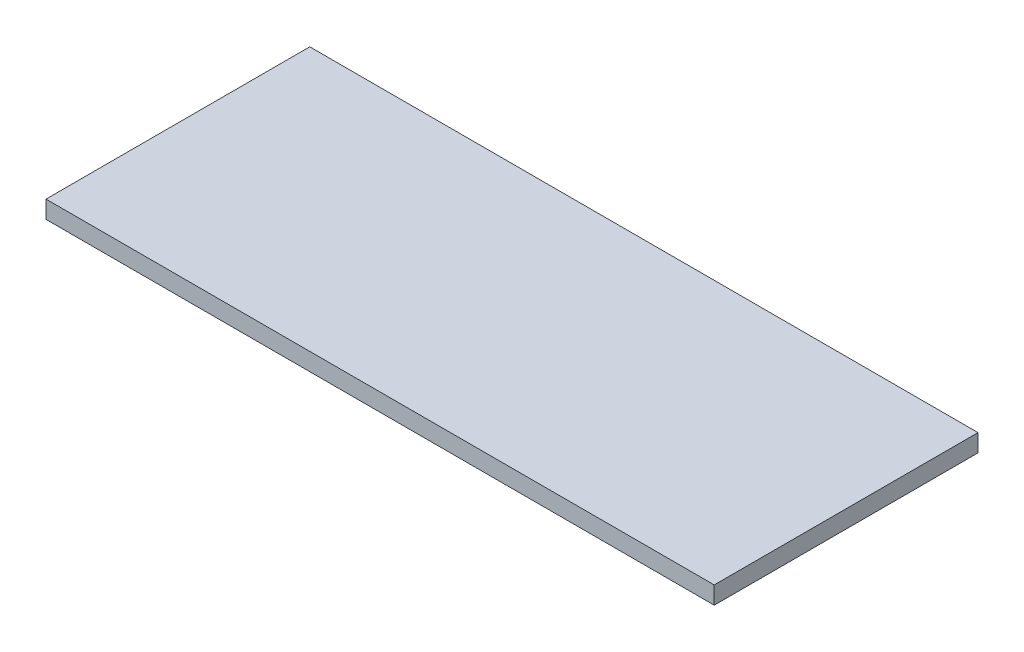
ISO-10303-21;
HEADER;
FILE_DESCRIPTION(('STEP AP214'),'2;1');
FILE_NAME('part.step','',(''),(''),'','','');
FILE_SCHEMA(('AUTOMOTIVE_DESIGN { 1 0 10303 214 1 1 1 1 }'));
ENDSEC;
DATA;
#1=APPLICATION_CONTEXT('core data for automotive mechanical design processes');
#2=APPLICATION_PROTOCOL_DEFINITION('international standard','automotive_design',2000,#1);
#3=PRODUCT_CONTEXT('',#1,'mechanical');
#4=PRODUCT('Part','Part','',(#3));
#5=PRODUCT_RELATED_PRODUCT_CATEGORY('part','',(#4));
#6=PRODUCT_DEFINITION_FORMATION('','',#4);
#7=PRODUCT_DEFINITION_CONTEXT('part definition',#1,'design');
#8=PRODUCT_DEFINITION('design','',#6,#7);
#9=PRODUCT_DEFINITION_SHAPE('','',#8);
#10=(LENGTH_UNIT() NAMED_UNIT(*) SI_UNIT(.MILLI.,.METRE.));
#11=(NAMED_UNIT(*) PLANE_ANGLE_UNIT() SI_UNIT($,.RADIAN.));
#12=(NAMED_UNIT(*) SI_UNIT($,.STERADIAN.) SOLID_ANGLE_UNIT());
#13=UNCERTAINTY_MEASURE_WITH_UNIT(LENGTH_MEASURE(1.E-05),#10,'distance_accuracy_value','');
#14=(GEOMETRIC_REPRESENTATION_CONTEXT(3) GLOBAL_UNCERTAINTY_ASSIGNED_CONTEXT((#13)) GLOBAL_UNIT_ASSIGNED_CONTEXT((#10,
#11,#12)) REPRESENTATION_CONTEXT('',''));
#15=CARTESIAN_POINT('',(0.,0.,0.));
#16=DIRECTION('',(0.,0.,1.));
#17=DIRECTION('',(1.,0.,0.));
#18=AXIS2_PLACEMENT_3D('',#15,#16,#17);
#19=CARTESIAN_POINT('',(190.,10.,75.));
#20=DIRECTION('',(-1.,0.,0.));
#21=DIRECTION('',(0.,0.,1.));
#22=AXIS2_PLACEMENT_3D('',#19,#20,#21);
#23=PLANE('',#22);
#24=DIRECTION('',(0.,0.,-1.));
#25=VECTOR('',#24,1.);
#26=CARTESIAN_POINT('',(190.,0.,75.));
#27=LINE('',#26,#25);
#28=CARTESIAN_POINT('',(190.,0.,75.));
#29=VERTEX_POINT('',#28);
#30=CARTESIAN_POINT('',(190.,0.,-75.));
#31=VERTEX_POINT('',#30);
#32=EDGE_CURVE('E98',#29,#31,#27,.T.);
#33=ORIENTED_EDGE('',*,*,#32,.T.);
#34=DIRECTION('',(0.,-1.,0.));
#35=VECTOR('',#34,1.);
#36=CARTESIAN_POINT('',(190.,10.,-75.));
#37=LINE('',#36,#35);
#38=CARTESIAN_POINT('',(190.,10.,-75.));
#39=VERTEX_POINT('',#38);
#40=EDGE_CURVE('E11',#39,#31,#37,.T.);
#41=ORIENTED_EDGE('',*,*,#40,.F.);
#42=DIRECTION('',(0.,0.,-1.));
#43=VECTOR('',#42,1.);
#44=CARTESIAN_POINT('',(190.,10.,75.));
#45=LINE('',#44,#43);
#46=CARTESIAN_POINT('',(190.,10.,75.));
#47=VERTEX_POINT('',#46);
#48=EDGE_CURVE('E86',#47,#39,#45,.T.);
#49=ORIENTED_EDGE('',*,*,#48,.F.);
#50=DIRECTION('',(0.,-1.,0.));
#51=VECTOR('',#50,1.);
#52=CARTESIAN_POINT('',(190.,10.,75.));
#53=LINE('',#52,#51);
#54=EDGE_CURVE('E94',#47,#29,#53,.T.);
#55=ORIENTED_EDGE('',*,*,#54,.T.);
#56=EDGE_LOOP('',(#33,#41,#49,#55));
#57=FACE_BOUND('',#56,.T.);
#58=ADVANCED_FACE('F35',(#57),#23,.F.);
#59=CARTESIAN_POINT('',(-190.,10.,-75.));
#60=DIRECTION('',(0.,0.,1.));
#61=DIRECTION('',(1.,0.,0.));
#62=AXIS2_PLACEMENT_3D('',#59,#60,#61);
#63=PLANE('',#62);
#64=DIRECTION('',(-1.,0.,0.));
#65=VECTOR('',#64,1.);
#66=CARTESIAN_POINT('',(-190.,0.,-75.));
#67=LINE('',#66,#65);
#68=CARTESIAN_POINT('',(-190.,0.,-75.));
#69=VERTEX_POINT('',#68);
#70=EDGE_CURVE('E90',#31,#69,#67,.T.);
#71=ORIENTED_EDGE('',*,*,#70,.T.);
#72=DIRECTION('',(0.,-1.,0.));
#73=VECTOR('',#72,1.);
#74=CARTESIAN_POINT('',(-190.,10.,-75.));
#75=LINE('',#74,#73);
#76=CARTESIAN_POINT('',(-190.,10.,-75.));
#77=VERTEX_POINT('',#76);
#78=EDGE_CURVE('E43',#77,#69,#75,.T.);
#79=ORIENTED_EDGE('',*,*,#78,.F.);
#80=DIRECTION('',(-1.,0.,0.));
#81=VECTOR('',#80,1.);
#82=CARTESIAN_POINT('',(-190.,10.,-75.));
#83=LINE('',#82,#81);
#84=EDGE_CURVE('E81',#39,#77,#83,.T.);
#85=ORIENTED_EDGE('',*,*,#84,.F.);
#86=ORIENTED_EDGE('',*,*,#40,.T.);
#87=EDGE_LOOP('',(#71,#79,#85,#86));
#88=FACE_BOUND('',#87,.T.);
#89=ADVANCED_FACE('F89',(#88),#63,.F.);
#90=CARTESIAN_POINT('',(-190.,10.,75.));
#91=DIRECTION('',(1.,0.,0.));
#92=DIRECTION('',(0.,0.,-1.));
#93=AXIS2_PLACEMENT_3D('',#90,#91,#92);
#94=PLANE('',#93);
#95=DIRECTION('',(0.,0.,1.));
#96=VECTOR('',#95,1.);
#97=CARTESIAN_POINT('',(-190.,0.,75.));
#98=LINE('',#97,#96);
#99=CARTESIAN_POINT('',(-190.,0.,75.));
#100=VERTEX_POINT('',#99);
#101=EDGE_CURVE('E68',#69,#100,#98,.T.);
#102=ORIENTED_EDGE('',*,*,#101,.T.);
#103=DIRECTION('',(0.,-1.,0.));
#104=VECTOR('',#103,1.);
#105=CARTESIAN_POINT('',(-190.,10.,75.));
#106=LINE('',#105,#104);
#107=CARTESIAN_POINT('',(-190.,10.,75.));
#108=VERTEX_POINT('',#107);
#109=EDGE_CURVE('E91',#108,#100,#106,.T.);
#110=ORIENTED_EDGE('',*,*,#109,.F.);
#111=DIRECTION('',(0.,0.,1.));
#112=VECTOR('',#111,1.);
#113=CARTESIAN_POINT('',(-190.,10.,75.));
#114=LINE('',#113,#112);
#115=EDGE_CURVE('E84',#77,#108,#114,.T.);
#116=ORIENTED_EDGE('',*,*,#115,.F.);
#117=ORIENTED_EDGE('',*,*,#78,.T.);
#118=EDGE_LOOP('',(#102,#110,#116,#117));
#119=FACE_BOUND('',#118,.T.);
#120=ADVANCED_FACE('F92',(#119),#94,.F.);
#121=CARTESIAN_POINT('',(-190.,10.,75.));
#122=DIRECTION('',(0.,0.,-1.));
#123=DIRECTION('',(-1.,0.,0.));
#124=AXIS2_PLACEMENT_3D('',#121,#122,#123);
#125=PLANE('',#124);
#126=DIRECTION('',(1.,0.,0.));
#127=VECTOR('',#126,1.);
#128=CARTESIAN_POINT('',(-190.,0.,75.));
#129=LINE('',#128,#127);
#130=EDGE_CURVE('E74',#100,#29,#129,.T.);
#131=ORIENTED_EDGE('',*,*,#130,.T.);
#132=ORIENTED_EDGE('',*,*,#54,.F.);
#133=DIRECTION('',(1.,0.,0.));
#134=VECTOR('',#133,1.);
#135=CARTESIAN_POINT('',(-190.,10.,75.));
#136=LINE('',#135,#134);
#137=EDGE_CURVE('E51',#108,#47,#136,.T.);
#138=ORIENTED_EDGE('',*,*,#137,.F.);
#139=ORIENTED_EDGE('',*,*,#109,.T.);
#140=EDGE_LOOP('',(#131,#132,#138,#139));
#141=FACE_BOUND('',#140,.T.);
#142=ADVANCED_FACE('F105',(#141),#125,.F.);
#143=CARTESIAN_POINT('',(0.,10.,0.));
#144=DIRECTION('',(0.,-1.,0.));
#145=DIRECTION('',(0.,0.,-1.));
#146=AXIS2_PLACEMENT_3D('',#143,#144,#145);
#147=PLANE('',#146);
#148=ORIENTED_EDGE('',*,*,#48,.T.);
#149=ORIENTED_EDGE('',*,*,#84,.T.);
#150=ORIENTED_EDGE('',*,*,#115,.T.);
#151=ORIENTED_EDGE('',*,*,#137,.T.);
#152=EDGE_LOOP('',(#148,#149,#150,#151));
#153=FACE_BOUND('',#152,.T.);
#154=ADVANCED_FACE('F82',(#153),#147,.F.);
#155=CARTESIAN_POINT('',(0.,0.,0.));
#156=DIRECTION('',(0.,-1.,0.));
#157=DIRECTION('',(0.,0.,-1.));
#158=AXIS2_PLACEMENT_3D('',#155,#156,#157);
#159=PLANE('',#158);
#160=ORIENTED_EDGE('',*,*,#32,.F.);
#161=ORIENTED_EDGE('',*,*,#130,.F.);
#162=ORIENTED_EDGE('',*,*,#101,.F.);
#163=ORIENTED_EDGE('',*,*,#70,.F.);
#164=EDGE_LOOP('',(#160,#161,#162,#163));
#165=FACE_BOUND('',#164,.T.);
#166=ADVANCED_FACE('F108',(#165),#159,.T.);
#167=CLOSED_SHELL('',(#58,#89,#120,#142,#154,#166));
#168=MANIFOLD_SOLID_BREP('B2',#167);
#169=ADVANCED_BREP_SHAPE_REPRESENTATION('',(#18,#168),#14);
#170=SHAPE_DEFINITION_REPRESENTATION(#9,#169);
ENDSEC;
END-ISO-10303-21;
